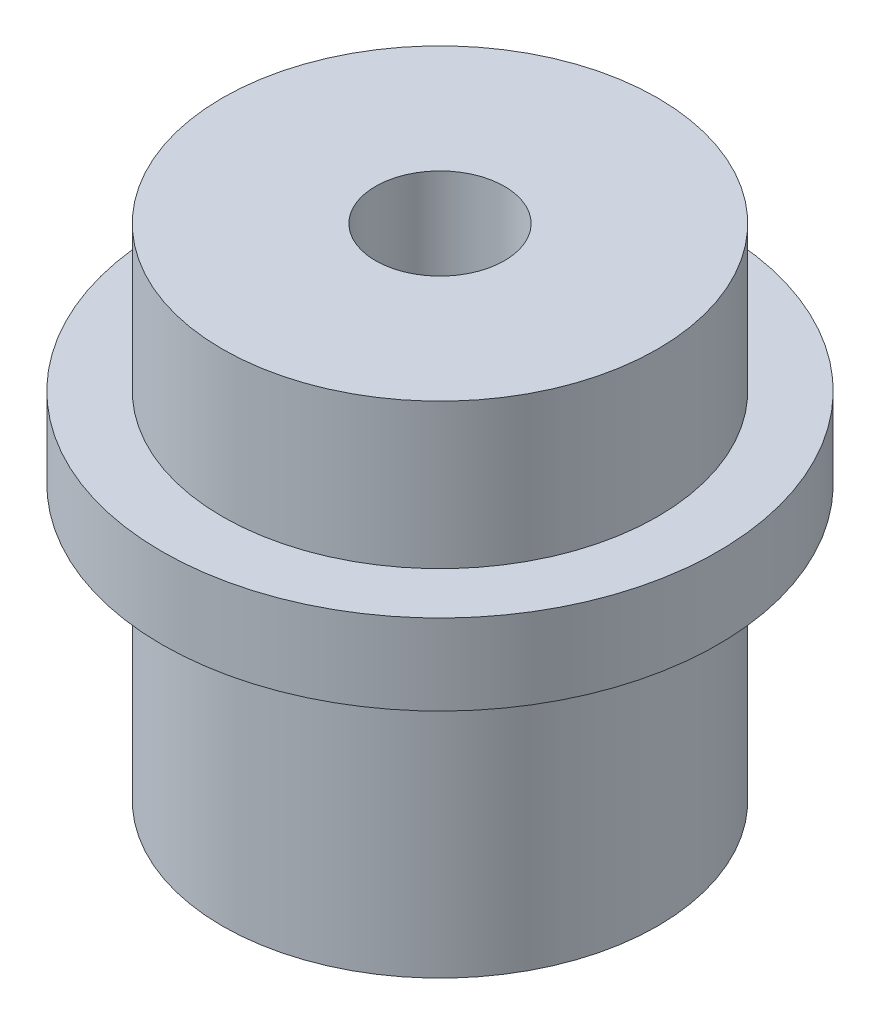
ISO-10303-21;
HEADER;
FILE_DESCRIPTION(('STEP AP214'),'2;1');
FILE_NAME('part.step','',(''),(''),'','','');
FILE_SCHEMA(('AUTOMOTIVE_DESIGN { 1 0 10303 214 1 1 1 1 }'));
ENDSEC;
DATA;
#1=APPLICATION_CONTEXT('core data for automotive mechanical design processes');
#2=APPLICATION_PROTOCOL_DEFINITION('international standard','automotive_design',2000,#1);
#3=PRODUCT_CONTEXT('',#1,'mechanical');
#4=PRODUCT('Part','Part','',(#3));
#5=PRODUCT_RELATED_PRODUCT_CATEGORY('part','',(#4));
#6=PRODUCT_DEFINITION_FORMATION('','',#4);
#7=PRODUCT_DEFINITION_CONTEXT('part definition',#1,'design');
#8=PRODUCT_DEFINITION('design','',#6,#7);
#9=PRODUCT_DEFINITION_SHAPE('','',#8);
#10=(LENGTH_UNIT() NAMED_UNIT(*) SI_UNIT(.MILLI.,.METRE.));
#11=(NAMED_UNIT(*) PLANE_ANGLE_UNIT() SI_UNIT($,.RADIAN.));
#12=(NAMED_UNIT(*) SI_UNIT($,.STERADIAN.) SOLID_ANGLE_UNIT());
#13=UNCERTAINTY_MEASURE_WITH_UNIT(LENGTH_MEASURE(1.E-05),#10,'distance_accuracy_value','');
#14=(GEOMETRIC_REPRESENTATION_CONTEXT(3) GLOBAL_UNCERTAINTY_ASSIGNED_CONTEXT((#13)) GLOBAL_UNIT_ASSIGNED_CONTEXT((#10,
#11,#12)) REPRESENTATION_CONTEXT('',''));
#15=CARTESIAN_POINT('',(0.,0.,0.));
#16=DIRECTION('',(0.,0.,1.));
#17=DIRECTION('',(1.,0.,0.));
#18=AXIS2_PLACEMENT_3D('',#15,#16,#17);
#19=CARTESIAN_POINT('',(0.,-11.43,0.));
#20=DIRECTION('',(0.,1.,0.));
#21=DIRECTION('',(0.,0.,1.));
#22=AXIS2_PLACEMENT_3D('',#19,#20,#21);
#23=CYLINDRICAL_SURFACE('',#22,17.145);
#24=CARTESIAN_POINT('',(0.,-27.94,0.));
#25=DIRECTION('',(0.,1.,0.));
#26=DIRECTION('',(0.,0.,1.));
#27=AXIS2_PLACEMENT_3D('',#24,#25,#26);
#28=CIRCLE('',#27,17.145);
#29=CARTESIAN_POINT('',(0.,-27.94,17.145));
#30=VERTEX_POINT('',#29);
#31=EDGE_CURVE('E45',#30,#30,#28,.T.);
#32=ORIENTED_EDGE('',*,*,#31,.T.);
#33=EDGE_LOOP('',(#32));
#34=FACE_BOUND('',#33,.T.);
#35=CARTESIAN_POINT('',(0.,-6.35,0.));
#36=DIRECTION('',(0.,1.,0.));
#37=DIRECTION('',(0.,0.,1.));
#38=AXIS2_PLACEMENT_3D('',#35,#36,#37);
#39=CIRCLE('',#38,17.145);
#40=CARTESIAN_POINT('',(0.,-6.35,17.145));
#41=VERTEX_POINT('',#40);
#42=EDGE_CURVE('E55',#41,#41,#39,.T.);
#43=ORIENTED_EDGE('',*,*,#42,.F.);
#44=EDGE_LOOP('',(#43));
#45=FACE_BOUND('',#44,.T.);
#46=ADVANCED_FACE('F34',(#34,#45),#23,.T.);
#47=CARTESIAN_POINT('',(0.,-27.94,0.));
#48=DIRECTION('',(0.,1.,0.));
#49=DIRECTION('',(0.,0.,1.));
#50=AXIS2_PLACEMENT_3D('',#47,#48,#49);
#51=PLANE('',#50);
#52=ORIENTED_EDGE('',*,*,#31,.F.);
#53=EDGE_LOOP('',(#52));
#54=FACE_BOUND('',#53,.T.);
#55=CARTESIAN_POINT('',(0.,-27.94,0.));
#56=DIRECTION('',(0.,1.,0.));
#57=DIRECTION('',(0.,0.,1.));
#58=AXIS2_PLACEMENT_3D('',#55,#56,#57);
#59=CIRCLE('',#58,5.08);
#60=CARTESIAN_POINT('',(0.,-27.94,5.08));
#61=VERTEX_POINT('',#60);
#62=EDGE_CURVE('E56',#61,#61,#59,.F.);
#63=ORIENTED_EDGE('',*,*,#62,.F.);
#64=EDGE_LOOP('',(#63));
#65=FACE_BOUND('',#64,.T.);
#66=ADVANCED_FACE('F81',(#54,#65),#51,.F.);
#67=CARTESIAN_POINT('',(0.,-6.35,0.));
#68=DIRECTION('',(0.,1.,0.));
#69=DIRECTION('',(0.,0.,1.));
#70=AXIS2_PLACEMENT_3D('',#67,#68,#69);
#71=CYLINDRICAL_SURFACE('',#70,21.9075);
#72=CARTESIAN_POINT('',(0.,-6.35,0.));
#73=DIRECTION('',(0.,1.,0.));
#74=DIRECTION('',(0.,0.,1.));
#75=AXIS2_PLACEMENT_3D('',#72,#73,#74);
#76=CIRCLE('',#75,21.9075);
#77=CARTESIAN_POINT('',(0.,-6.35,21.9075));
#78=VERTEX_POINT('',#77);
#79=EDGE_CURVE('E49',#78,#78,#76,.T.);
#80=ORIENTED_EDGE('',*,*,#79,.T.);
#81=EDGE_LOOP('',(#80));
#82=FACE_BOUND('',#81,.T.);
#83=CARTESIAN_POINT('',(0.,0.,0.));
#84=DIRECTION('',(0.,1.,0.));
#85=DIRECTION('',(0.,0.,1.));
#86=AXIS2_PLACEMENT_3D('',#83,#84,#85);
#87=CIRCLE('',#86,21.9075);
#88=CARTESIAN_POINT('',(0.,0.,21.9075));
#89=VERTEX_POINT('',#88);
#90=EDGE_CURVE('E52',#89,#89,#87,.T.);
#91=ORIENTED_EDGE('',*,*,#90,.F.);
#92=EDGE_LOOP('',(#91));
#93=FACE_BOUND('',#92,.T.);
#94=ADVANCED_FACE('F86',(#82,#93),#71,.T.);
#95=CARTESIAN_POINT('',(0.,-6.35,0.));
#96=DIRECTION('',(0.,1.,0.));
#97=DIRECTION('',(0.,0.,1.));
#98=AXIS2_PLACEMENT_3D('',#95,#96,#97);
#99=PLANE('',#98);
#100=ORIENTED_EDGE('',*,*,#42,.T.);
#101=EDGE_LOOP('',(#100));
#102=FACE_BOUND('',#101,.T.);
#103=ORIENTED_EDGE('',*,*,#79,.F.);
#104=EDGE_LOOP('',(#103));
#105=FACE_BOUND('',#104,.T.);
#106=ADVANCED_FACE('F77',(#102,#105),#99,.F.);
#107=CARTESIAN_POINT('',(0.,0.,0.));
#108=DIRECTION('',(0.,1.,0.));
#109=DIRECTION('',(0.,0.,1.));
#110=AXIS2_PLACEMENT_3D('',#107,#108,#109);
#111=PLANE('',#110);
#112=CARTESIAN_POINT('',(0.,0.,0.));
#113=DIRECTION('',(0.,1.,0.));
#114=DIRECTION('',(0.,0.,1.));
#115=AXIS2_PLACEMENT_3D('',#112,#113,#114);
#116=CIRCLE('',#115,17.145);
#117=CARTESIAN_POINT('',(0.,0.,17.145));
#118=VERTEX_POINT('',#117);
#119=EDGE_CURVE('E10',#118,#118,#116,.F.);
#120=ORIENTED_EDGE('',*,*,#119,.T.);
#121=EDGE_LOOP('',(#120));
#122=FACE_BOUND('',#121,.T.);
#123=ORIENTED_EDGE('',*,*,#90,.T.);
#124=EDGE_LOOP('',(#123));
#125=FACE_BOUND('',#124,.T.);
#126=ADVANCED_FACE('F71',(#122,#125),#111,.T.);
#127=CARTESIAN_POINT('',(0.,11.43,0.));
#128=DIRECTION('',(0.,1.,0.));
#129=DIRECTION('',(0.,0.,1.));
#130=AXIS2_PLACEMENT_3D('',#127,#128,#129);
#131=PLANE('',#130);
#132=CARTESIAN_POINT('',(0.,11.43,0.));
#133=DIRECTION('',(0.,1.,0.));
#134=DIRECTION('',(0.,0.,1.));
#135=AXIS2_PLACEMENT_3D('',#132,#133,#134);
#136=CIRCLE('',#135,17.145);
#137=CARTESIAN_POINT('',(0.,11.43,17.145));
#138=VERTEX_POINT('',#137);
#139=EDGE_CURVE('E41',#138,#138,#136,.T.);
#140=ORIENTED_EDGE('',*,*,#139,.T.);
#141=EDGE_LOOP('',(#140));
#142=FACE_BOUND('',#141,.T.);
#143=CARTESIAN_POINT('',(0.,11.43,0.));
#144=DIRECTION('',(0.,1.,0.));
#145=DIRECTION('',(0.,0.,1.));
#146=AXIS2_PLACEMENT_3D('',#143,#144,#145);
#147=CIRCLE('',#146,5.08);
#148=CARTESIAN_POINT('',(0.,11.43,5.08));
#149=VERTEX_POINT('',#148);
#150=EDGE_CURVE('E63',#149,#149,#147,.T.);
#151=ORIENTED_EDGE('',*,*,#150,.F.);
#152=EDGE_LOOP('',(#151));
#153=FACE_BOUND('',#152,.T.);
#154=ADVANCED_FACE('F69',(#142,#153),#131,.T.);
#155=ORIENTED_EDGE('',*,*,#119,.F.);
#156=EDGE_LOOP('',(#155));
#157=FACE_BOUND('',#156,.T.);
#158=ORIENTED_EDGE('',*,*,#139,.F.);
#159=EDGE_LOOP('',(#158));
#160=FACE_BOUND('',#159,.T.);
#161=ADVANCED_FACE('F36',(#157,#160),#23,.T.);
#162=CARTESIAN_POINT('',(0.,-56.6768195879186,0.));
#163=DIRECTION('',(0.,1.,0.));
#164=DIRECTION('',(0.,0.,1.));
#165=AXIS2_PLACEMENT_3D('',#162,#163,#164);
#166=CYLINDRICAL_SURFACE('',#165,5.08);
#167=ORIENTED_EDGE('',*,*,#62,.T.);
#168=EDGE_LOOP('',(#167));
#169=FACE_BOUND('',#168,.T.);
#170=ORIENTED_EDGE('',*,*,#150,.T.);
#171=EDGE_LOOP('',(#170));
#172=FACE_BOUND('',#171,.T.);
#173=ADVANCED_FACE('F67',(#169,#172),#166,.F.);
#174=CLOSED_SHELL('',(#46,#66,#94,#106,#126,#154,#161,#173));
#175=MANIFOLD_SOLID_BREP('B2',#174);
#176=ADVANCED_BREP_SHAPE_REPRESENTATION('',(#18,#175),#14);
#177=SHAPE_DEFINITION_REPRESENTATION(#9,#176);
ENDSEC;
END-ISO-10303-21;
